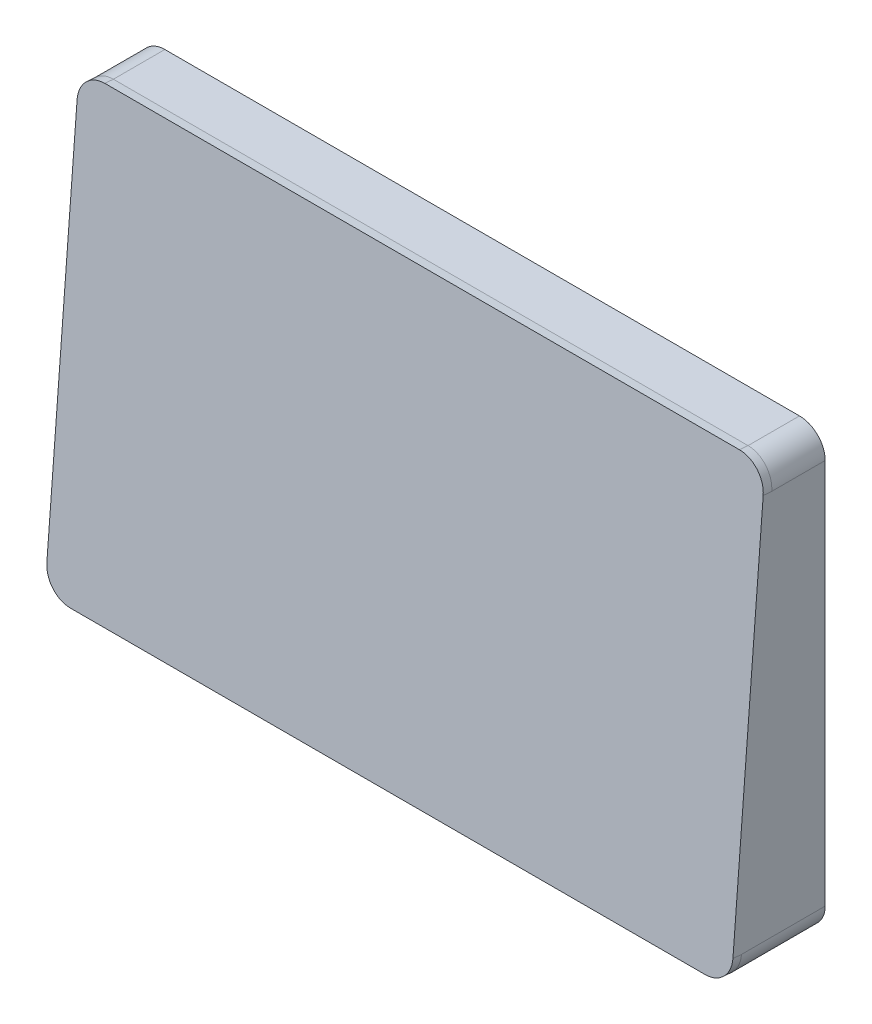
ISO-10303-21;
HEADER;
FILE_DESCRIPTION(('STEP AP214'),'2;1');
FILE_NAME('part.step','',(''),(''),'','','');
FILE_SCHEMA(('AUTOMOTIVE_DESIGN { 1 0 10303 214 1 1 1 1 }'));
ENDSEC;
DATA;
#1=APPLICATION_CONTEXT('core data for automotive mechanical design processes');
#2=APPLICATION_PROTOCOL_DEFINITION('international standard','automotive_design',2000,#1);
#3=PRODUCT_CONTEXT('',#1,'mechanical');
#4=PRODUCT('Part','Part','',(#3));
#5=PRODUCT_RELATED_PRODUCT_CATEGORY('part','',(#4));
#6=PRODUCT_DEFINITION_FORMATION('','',#4);
#7=PRODUCT_DEFINITION_CONTEXT('part definition',#1,'design');
#8=PRODUCT_DEFINITION('design','',#6,#7);
#9=PRODUCT_DEFINITION_SHAPE('','',#8);
#10=(LENGTH_UNIT() NAMED_UNIT(*) SI_UNIT(.MILLI.,.METRE.));
#11=(NAMED_UNIT(*) PLANE_ANGLE_UNIT() SI_UNIT($,.RADIAN.));
#12=(NAMED_UNIT(*) SI_UNIT($,.STERADIAN.) SOLID_ANGLE_UNIT());
#13=UNCERTAINTY_MEASURE_WITH_UNIT(LENGTH_MEASURE(1.E-05),#10,'distance_accuracy_value','');
#14=(GEOMETRIC_REPRESENTATION_CONTEXT(3) GLOBAL_UNCERTAINTY_ASSIGNED_CONTEXT((#13)) GLOBAL_UNIT_ASSIGNED_CONTEXT((#10,
#11,#12)) REPRESENTATION_CONTEXT('',''));
#15=CARTESIAN_POINT('',(0.,0.,0.));
#16=DIRECTION('',(0.,0.,1.));
#17=DIRECTION('',(1.,0.,0.));
#18=AXIS2_PLACEMENT_3D('',#15,#16,#17);
#19=CARTESIAN_POINT('',(-147.675,90.1,0.));
#20=DIRECTION('',(0.,0.,1.));
#21=DIRECTION('',(1.,0.,0.));
#22=AXIS2_PLACEMENT_3D('',#19,#20,#21);
#23=PLANE('',#22);
#24=CARTESIAN_POINT('',(-147.675,90.1,0.));
#25=DIRECTION('',(0.,0.,1.));
#26=DIRECTION('',(1.,0.,0.));
#27=AXIS2_PLACEMENT_3D('',#24,#25,#26);
#28=CIRCLE('',#27,5.99999999999998);
#29=CARTESIAN_POINT('',(-147.675,96.1,0.));
#30=VERTEX_POINT('',#29);
#31=CARTESIAN_POINT('',(-153.675,90.1,0.));
#32=VERTEX_POINT('',#31);
#33=EDGE_CURVE('E358',#30,#32,#28,.T.);
#34=ORIENTED_EDGE('',*,*,#33,.F.);
#35=DIRECTION('',(-1.,0.,0.));
#36=VECTOR('',#35,1.);
#37=CARTESIAN_POINT('',(-147.675,96.1,0.));
#38=LINE('',#37,#36);
#39=CARTESIAN_POINT('',(0.32500000000016,96.1,0.));
#40=VERTEX_POINT('',#39);
#41=EDGE_CURVE('E341',#40,#30,#38,.T.);
#42=ORIENTED_EDGE('',*,*,#41,.F.);
#43=CARTESIAN_POINT('',(0.325000000000156,90.1,0.));
#44=DIRECTION('',(0.,0.,1.));
#45=DIRECTION('',(1.,0.,0.));
#46=AXIS2_PLACEMENT_3D('',#43,#44,#45);
#47=CIRCLE('',#46,6.);
#48=CARTESIAN_POINT('',(6.32500000000016,90.1,0.));
#49=VERTEX_POINT('',#48);
#50=EDGE_CURVE('E344',#49,#40,#47,.T.);
#51=ORIENTED_EDGE('',*,*,#50,.F.);
#52=DIRECTION('',(0.,1.,0.));
#53=VECTOR('',#52,1.);
#54=CARTESIAN_POINT('',(6.32500000000015,90.1,0.));
#55=LINE('',#54,#53);
#56=CARTESIAN_POINT('',(6.32500000000014,0.0999999999999988,0.));
#57=VERTEX_POINT('',#56);
#58=EDGE_CURVE('E347',#57,#49,#55,.T.);
#59=ORIENTED_EDGE('',*,*,#58,.F.);
#60=CARTESIAN_POINT('',(0.325000000000145,0.1,0.));
#61=DIRECTION('',(0.,0.,1.));
#62=DIRECTION('',(1.,0.,0.));
#63=AXIS2_PLACEMENT_3D('',#60,#61,#62);
#64=CIRCLE('',#63,6.);
#65=CARTESIAN_POINT('',(0.325000000000144,-5.9,0.));
#66=VERTEX_POINT('',#65);
#67=EDGE_CURVE('E350',#66,#57,#64,.T.);
#68=ORIENTED_EDGE('',*,*,#67,.F.);
#69=DIRECTION('',(1.,0.,0.));
#70=VECTOR('',#69,1.);
#71=CARTESIAN_POINT('',(0.325000000000145,-5.9,0.));
#72=LINE('',#71,#70);
#73=CARTESIAN_POINT('',(-147.675,-5.89999999999998,0.));
#74=VERTEX_POINT('',#73);
#75=EDGE_CURVE('E353',#74,#66,#72,.T.);
#76=ORIENTED_EDGE('',*,*,#75,.F.);
#77=CARTESIAN_POINT('',(-147.675,0.1,0.));
#78=DIRECTION('',(0.,0.,1.));
#79=DIRECTION('',(1.,0.,0.));
#80=AXIS2_PLACEMENT_3D('',#77,#78,#79);
#81=CIRCLE('',#80,5.99999999999998);
#82=CARTESIAN_POINT('',(-153.675,0.0999999999999877,0.));
#83=VERTEX_POINT('',#82);
#84=EDGE_CURVE('E355',#83,#74,#81,.T.);
#85=ORIENTED_EDGE('',*,*,#84,.F.);
#86=DIRECTION('',(0.,-1.,0.));
#87=VECTOR('',#86,1.);
#88=CARTESIAN_POINT('',(-153.675,0.0999999999999873,0.));
#89=LINE('',#88,#87);
#90=EDGE_CURVE('E321',#32,#83,#89,.T.);
#91=ORIENTED_EDGE('',*,*,#90,.F.);
#92=EDGE_LOOP('',(#34,#42,#51,#59,#68,#76,#85,#91));
#93=FACE_BOUND('',#92,.T.);
#94=CARTESIAN_POINT('',(0.325000000000156,90.1,0.));
#95=DIRECTION('',(0.,0.,1.));
#96=DIRECTION('',(1.,0.,0.));
#97=AXIS2_PLACEMENT_3D('',#94,#95,#96);
#98=CIRCLE('',#97,3.);
#99=CARTESIAN_POINT('',(3.32500000000016,90.1,0.));
#100=VERTEX_POINT('',#99);
#101=CARTESIAN_POINT('',(0.325000000000158,93.1,0.));
#102=VERTEX_POINT('',#101);
#103=EDGE_CURVE('E399',#100,#102,#98,.T.);
#104=ORIENTED_EDGE('',*,*,#103,.T.);
#105=DIRECTION('',(-1.,0.,0.));
#106=VECTOR('',#105,1.);
#107=CARTESIAN_POINT('',(-147.675,93.1,0.));
#108=LINE('',#107,#106);
#109=CARTESIAN_POINT('',(-147.675,93.1,0.));
#110=VERTEX_POINT('',#109);
#111=EDGE_CURVE('E396',#102,#110,#108,.T.);
#112=ORIENTED_EDGE('',*,*,#111,.T.);
#113=CARTESIAN_POINT('',(-147.675,90.1,0.));
#114=DIRECTION('',(0.,0.,1.));
#115=DIRECTION('',(1.,0.,0.));
#116=AXIS2_PLACEMENT_3D('',#113,#114,#115);
#117=CIRCLE('',#116,2.99999999999998);
#118=CARTESIAN_POINT('',(-150.675,90.1,0.));
#119=VERTEX_POINT('',#118);
#120=EDGE_CURVE('E393',#110,#119,#117,.T.);
#121=ORIENTED_EDGE('',*,*,#120,.T.);
#122=DIRECTION('',(0.,-1.,0.));
#123=VECTOR('',#122,1.);
#124=CARTESIAN_POINT('',(-150.675,0.0999999999999873,0.));
#125=LINE('',#124,#123);
#126=CARTESIAN_POINT('',(-150.675,0.0999999999999886,0.));
#127=VERTEX_POINT('',#126);
#128=EDGE_CURVE('E390',#119,#127,#125,.T.);
#129=ORIENTED_EDGE('',*,*,#128,.T.);
#130=CARTESIAN_POINT('',(-147.675,0.1,0.));
#131=DIRECTION('',(0.,0.,1.));
#132=DIRECTION('',(1.,0.,0.));
#133=AXIS2_PLACEMENT_3D('',#130,#131,#132);
#134=CIRCLE('',#133,2.99999999999998);
#135=CARTESIAN_POINT('',(-147.675,-2.89999999999999,0.));
#136=VERTEX_POINT('',#135);
#137=EDGE_CURVE('E387',#127,#136,#134,.T.);
#138=ORIENTED_EDGE('',*,*,#137,.T.);
#139=DIRECTION('',(1.,0.,0.));
#140=VECTOR('',#139,1.);
#141=CARTESIAN_POINT('',(0.325000000000145,-2.9,0.));
#142=LINE('',#141,#140);
#143=CARTESIAN_POINT('',(0.325000000000144,-2.9,0.));
#144=VERTEX_POINT('',#143);
#145=EDGE_CURVE('E384',#136,#144,#142,.T.);
#146=ORIENTED_EDGE('',*,*,#145,.T.);
#147=CARTESIAN_POINT('',(0.325000000000145,0.1,0.));
#148=DIRECTION('',(0.,0.,1.));
#149=DIRECTION('',(1.,0.,0.));
#150=AXIS2_PLACEMENT_3D('',#147,#148,#149);
#151=CIRCLE('',#150,3.);
#152=CARTESIAN_POINT('',(3.32500000000014,0.0999999999999999,0.));
#153=VERTEX_POINT('',#152);
#154=EDGE_CURVE('E381',#144,#153,#151,.T.);
#155=ORIENTED_EDGE('',*,*,#154,.T.);
#156=DIRECTION('',(0.,1.,0.));
#157=VECTOR('',#156,1.);
#158=CARTESIAN_POINT('',(3.32500000000016,90.1,0.));
#159=LINE('',#158,#157);
#160=EDGE_CURVE('E378',#153,#100,#159,.T.);
#161=ORIENTED_EDGE('',*,*,#160,.T.);
#162=EDGE_LOOP('',(#104,#112,#121,#129,#138,#146,#155,#161));
#163=FACE_BOUND('',#162,.T.);
#164=ADVANCED_FACE('F33',(#93,#163),#23,.F.);
#165=CARTESIAN_POINT('',(-147.675,90.1,20.));
#166=DIRECTION('',(0.,0.,-1.));
#167=DIRECTION('',(-1.,0.,0.));
#168=AXIS2_PLACEMENT_3D('',#165,#166,#167);
#169=CYLINDRICAL_SURFACE('',#168,5.99999999999998);
#170=DIRECTION('',(0.,0.,-1.));
#171=VECTOR('',#170,1.);
#172=CARTESIAN_POINT('',(-153.675,90.1,20.));
#173=LINE('',#172,#171);
#174=CARTESIAN_POINT('',(-153.675,90.1,12.4705882352941));
#175=VERTEX_POINT('',#174);
#176=EDGE_CURVE('E41',#175,#32,#173,.T.);
#177=ORIENTED_EDGE('',*,*,#176,.F.);
#178=CARTESIAN_POINT('',(-147.675,90.1,12.4705882352941));
#179=DIRECTION('',(0.,-0.0781912453186315,-0.996938377812552));
#180=DIRECTION('',(0.,0.996938377812552,-0.0781912453186315));
#181=AXIS2_PLACEMENT_3D('',#178,#179,#180);
#182=ELLIPSE('',#181,6.01842614702523,5.99999999999998);
#183=CARTESIAN_POINT('',(-147.675,96.1,12.));
#184=VERTEX_POINT('',#183);
#185=EDGE_CURVE('E402',#175,#184,#182,.T.);
#186=ORIENTED_EDGE('',*,*,#185,.T.);
#187=DIRECTION('',(0.,0.,-1.));
#188=VECTOR('',#187,1.);
#189=CARTESIAN_POINT('',(-147.675,96.1,20.));
#190=LINE('',#189,#188);
#191=EDGE_CURVE('E338',#184,#30,#190,.T.);
#192=ORIENTED_EDGE('',*,*,#191,.T.);
#193=ORIENTED_EDGE('',*,*,#33,.T.);
#194=EDGE_LOOP('',(#177,#186,#192,#193));
#195=FACE_BOUND('',#194,.T.);
#196=ADVANCED_FACE('F35',(#195),#169,.T.);
#197=CARTESIAN_POINT('',(-153.675,0.0999999999999873,20.));
#198=DIRECTION('',(1.,0.,0.));
#199=DIRECTION('',(0.,1.,0.));
#200=AXIS2_PLACEMENT_3D('',#197,#198,#199);
#201=PLANE('',#200);
#202=DIRECTION('',(0.,0.,-1.));
#203=VECTOR('',#202,1.);
#204=CARTESIAN_POINT('',(-153.675,0.0999999999999877,20.));
#205=LINE('',#204,#203);
#206=CARTESIAN_POINT('',(-153.675,0.0999999999999951,19.5294117647059));
#207=VERTEX_POINT('',#206);
#208=EDGE_CURVE('E317',#207,#83,#205,.T.);
#209=ORIENTED_EDGE('',*,*,#208,.F.);
#210=DIRECTION('',(0.,-0.0781912453186315,-0.996938377812551));
#211=VECTOR('',#210,1.);
#212=CARTESIAN_POINT('',(-153.675,0.256382490637258,21.523288520331));
#213=LINE('',#212,#211);
#214=CARTESIAN_POINT('',(-153.675,0.256382490637258,21.523288520331));
#215=VERTEX_POINT('',#214);
#216=EDGE_CURVE('E318',#215,#207,#213,.T.);
#217=ORIENTED_EDGE('',*,*,#216,.F.);
#218=DIRECTION('',(0.,-0.996938377812551,0.0781912453186315));
#219=VECTOR('',#218,1.);
#220=CARTESIAN_POINT('',(-153.675,90.2563824906373,14.4644649909192));
#221=LINE('',#220,#219);
#222=CARTESIAN_POINT('',(-153.675,90.2563824906373,14.4644649909192));
#223=VERTEX_POINT('',#222);
#224=EDGE_CURVE('E238',#223,#215,#221,.T.);
#225=ORIENTED_EDGE('',*,*,#224,.F.);
#226=DIRECTION('',(0.,-0.0781912453186315,-0.996938377812551));
#227=VECTOR('',#226,1.);
#228=CARTESIAN_POINT('',(-153.675,90.2563824906373,14.4644649909192));
#229=LINE('',#228,#227);
#230=EDGE_CURVE('E437',#223,#175,#229,.T.);
#231=ORIENTED_EDGE('',*,*,#230,.T.);
#232=ORIENTED_EDGE('',*,*,#176,.T.);
#233=ORIENTED_EDGE('',*,*,#90,.T.);
#234=EDGE_LOOP('',(#209,#217,#225,#231,#232,#233));
#235=FACE_BOUND('',#234,.T.);
#236=ADVANCED_FACE('F306',(#235),#201,.F.);
#237=CARTESIAN_POINT('',(-147.675,0.1,20.));
#238=DIRECTION('',(0.,0.,-1.));
#239=DIRECTION('',(-1.,0.,0.));
#240=AXIS2_PLACEMENT_3D('',#237,#238,#239);
#241=CYLINDRICAL_SURFACE('',#240,5.99999999999998);
#242=DIRECTION('',(0.,0.,-1.));
#243=VECTOR('',#242,1.);
#244=CARTESIAN_POINT('',(-147.675,-5.89999999999998,20.));
#245=LINE('',#244,#243);
#246=CARTESIAN_POINT('',(-147.675,-5.89999999999998,20.));
#247=VERTEX_POINT('',#246);
#248=EDGE_CURVE('E324',#247,#74,#245,.T.);
#249=ORIENTED_EDGE('',*,*,#248,.F.);
#250=CARTESIAN_POINT('',(-147.675,0.1,19.5294117647059));
#251=DIRECTION('',(0.,-0.0781912453186315,-0.996938377812552));
#252=DIRECTION('',(0.,0.996938377812552,-0.0781912453186315));
#253=AXIS2_PLACEMENT_3D('',#250,#251,#252);
#254=ELLIPSE('',#253,6.01842614702523,5.99999999999998);
#255=EDGE_CURVE('E405',#247,#207,#254,.T.);
#256=ORIENTED_EDGE('',*,*,#255,.T.);
#257=ORIENTED_EDGE('',*,*,#208,.T.);
#258=ORIENTED_EDGE('',*,*,#84,.T.);
#259=EDGE_LOOP('',(#249,#256,#257,#258));
#260=FACE_BOUND('',#259,.T.);
#261=ADVANCED_FACE('F303',(#260),#241,.T.);
#262=CARTESIAN_POINT('',(0.325000000000145,-5.9,20.));
#263=DIRECTION('',(0.,1.,0.));
#264=DIRECTION('',(-1.,0.,0.));
#265=AXIS2_PLACEMENT_3D('',#262,#263,#264);
#266=PLANE('',#265);
#267=CARTESIAN_POINT('',(-5.67499999999985,-5.90000000000002,10.25));
#268=DIRECTION('',(0.,1.,0.));
#269=DIRECTION('',(-1.,0.,0.));
#270=AXIS2_PLACEMENT_3D('',#267,#268,#269);
#271=CIRCLE('',#270,1.);
#272=CARTESIAN_POINT('',(-6.67499999999985,-5.90000000000002,10.25));
#273=VERTEX_POINT('',#272);
#274=EDGE_CURVE('E225',#273,#273,#271,.T.);
#275=ORIENTED_EDGE('',*,*,#274,.T.);
#276=EDGE_LOOP('',(#275));
#277=FACE_BOUND('',#276,.T.);
#278=CARTESIAN_POINT('',(-9.67499999999985,-5.90000000000002,10.25));
#279=DIRECTION('',(0.,1.,0.));
#280=DIRECTION('',(-1.,0.,0.));
#281=AXIS2_PLACEMENT_3D('',#278,#279,#280);
#282=CIRCLE('',#281,1.);
#283=CARTESIAN_POINT('',(-10.6749999999999,-5.90000000000002,10.25));
#284=VERTEX_POINT('',#283);
#285=EDGE_CURVE('E572',#284,#284,#282,.T.);
#286=ORIENTED_EDGE('',*,*,#285,.T.);
#287=EDGE_LOOP('',(#286));
#288=FACE_BOUND('',#287,.T.);
#289=DIRECTION('',(-1.,0.,0.));
#290=VECTOR('',#289,1.);
#291=CARTESIAN_POINT('',(-135.675,-5.9,8.));
#292=LINE('',#291,#290);
#293=CARTESIAN_POINT('',(-126.675,-5.9,8.));
#294=VERTEX_POINT('',#293);
#295=CARTESIAN_POINT('',(-135.675,-5.9,8.));
#296=VERTEX_POINT('',#295);
#297=EDGE_CURVE('E202',#294,#296,#292,.T.);
#298=ORIENTED_EDGE('',*,*,#297,.T.);
#299=DIRECTION('',(0.,0.,1.));
#300=VECTOR('',#299,1.);
#301=CARTESIAN_POINT('',(-135.675,-5.9,12.5));
#302=LINE('',#301,#300);
#303=CARTESIAN_POINT('',(-135.675,-5.9,12.5));
#304=VERTEX_POINT('',#303);
#305=EDGE_CURVE('E196',#296,#304,#302,.T.);
#306=ORIENTED_EDGE('',*,*,#305,.T.);
#307=DIRECTION('',(1.,0.,0.));
#308=VECTOR('',#307,1.);
#309=CARTESIAN_POINT('',(-135.675,-5.9,12.5));
#310=LINE('',#309,#308);
#311=CARTESIAN_POINT('',(-126.675,-5.89999999999998,12.5));
#312=VERTEX_POINT('',#311);
#313=EDGE_CURVE('E205',#304,#312,#310,.T.);
#314=ORIENTED_EDGE('',*,*,#313,.T.);
#315=DIRECTION('',(0.,0.,-1.));
#316=VECTOR('',#315,1.);
#317=CARTESIAN_POINT('',(-126.675,-5.9,12.5));
#318=LINE('',#317,#316);
#319=EDGE_CURVE('E48',#312,#294,#318,.T.);
#320=ORIENTED_EDGE('',*,*,#319,.T.);
#321=EDGE_LOOP('',(#298,#306,#314,#320));
#322=FACE_BOUND('',#321,.T.);
#323=ORIENTED_EDGE('',*,*,#75,.T.);
#324=DIRECTION('',(0.,0.,-1.));
#325=VECTOR('',#324,1.);
#326=CARTESIAN_POINT('',(0.325000000000144,-5.9,20.));
#327=LINE('',#326,#325);
#328=CARTESIAN_POINT('',(0.325000000000144,-5.9,20.));
#329=VERTEX_POINT('',#328);
#330=EDGE_CURVE('E327',#329,#66,#327,.T.);
#331=ORIENTED_EDGE('',*,*,#330,.F.);
#332=DIRECTION('',(1.,0.,0.));
#333=VECTOR('',#332,1.);
#334=CARTESIAN_POINT('',(0.325000000000145,-5.9,20.));
#335=LINE('',#334,#333);
#336=EDGE_CURVE('E340',#247,#329,#335,.T.);
#337=ORIENTED_EDGE('',*,*,#336,.F.);
#338=ORIENTED_EDGE('',*,*,#248,.T.);
#339=EDGE_LOOP('',(#323,#331,#337,#338));
#340=FACE_BOUND('',#339,.T.);
#341=ADVANCED_FACE('F209',(#277,#288,#322,#340),#266,.F.);
#342=CARTESIAN_POINT('',(0.325000000000145,0.1,20.));
#343=DIRECTION('',(0.,0.,-1.));
#344=DIRECTION('',(-1.,0.,0.));
#345=AXIS2_PLACEMENT_3D('',#342,#343,#344);
#346=CYLINDRICAL_SURFACE('',#345,6.);
#347=DIRECTION('',(0.,0.,-1.));
#348=VECTOR('',#347,1.);
#349=CARTESIAN_POINT('',(6.32500000000014,0.0999999999999988,20.));
#350=LINE('',#349,#348);
#351=CARTESIAN_POINT('',(6.32500000000015,0.100000000000015,19.5294117647059));
#352=VERTEX_POINT('',#351);
#353=EDGE_CURVE('E332',#352,#57,#350,.T.);
#354=ORIENTED_EDGE('',*,*,#353,.F.);
#355=CARTESIAN_POINT('',(0.325000000000145,0.1,19.5294117647059));
#356=DIRECTION('',(0.,-0.0781912453186315,-0.996938377812552));
#357=DIRECTION('',(0.,0.996938377812552,-0.0781912453186315));
#358=AXIS2_PLACEMENT_3D('',#355,#356,#357);
#359=ELLIPSE('',#358,6.01842614702525,6.);
#360=EDGE_CURVE('E407',#352,#329,#359,.T.);
#361=ORIENTED_EDGE('',*,*,#360,.T.);
#362=ORIENTED_EDGE('',*,*,#330,.T.);
#363=ORIENTED_EDGE('',*,*,#67,.T.);
#364=EDGE_LOOP('',(#354,#361,#362,#363));
#365=FACE_BOUND('',#364,.T.);
#366=ADVANCED_FACE('F296',(#365),#346,.T.);
#367=CARTESIAN_POINT('',(6.32500000000015,90.1,20.));
#368=DIRECTION('',(-1.,0.,0.));
#369=DIRECTION('',(0.,-1.,0.));
#370=AXIS2_PLACEMENT_3D('',#367,#368,#369);
#371=PLANE('',#370);
#372=DIRECTION('',(0.,0.,-1.));
#373=VECTOR('',#372,1.);
#374=CARTESIAN_POINT('',(6.32500000000016,90.1,20.));
#375=LINE('',#374,#373);
#376=CARTESIAN_POINT('',(6.32500000000015,90.1,12.4705882352941));
#377=VERTEX_POINT('',#376);
#378=EDGE_CURVE('E334',#377,#49,#375,.T.);
#379=ORIENTED_EDGE('',*,*,#378,.F.);
#380=DIRECTION('',(0.,-0.0781912453186315,-0.996938377812551));
#381=VECTOR('',#380,1.);
#382=CARTESIAN_POINT('',(6.32500000000015,90.2563824906373,14.4644649909192));
#383=LINE('',#382,#381);
#384=CARTESIAN_POINT('',(6.32500000000015,90.2563824906373,14.4644649909192));
#385=VERTEX_POINT('',#384);
#386=EDGE_CURVE('E449',#385,#377,#383,.T.);
#387=ORIENTED_EDGE('',*,*,#386,.F.);
#388=DIRECTION('',(0.,0.996938377812551,-0.0781912453186315));
#389=VECTOR('',#388,1.);
#390=CARTESIAN_POINT('',(6.32500000000014,0.256382490637278,21.523288520331));
#391=LINE('',#390,#389);
#392=CARTESIAN_POINT('',(6.32500000000015,0.256382490637278,21.523288520331));
#393=VERTEX_POINT('',#392);
#394=EDGE_CURVE('E461',#393,#385,#391,.T.);
#395=ORIENTED_EDGE('',*,*,#394,.F.);
#396=DIRECTION('',(0.,-0.0781912453186315,-0.996938377812551));
#397=VECTOR('',#396,1.);
#398=CARTESIAN_POINT('',(6.32500000000015,0.256382490637278,21.523288520331));
#399=LINE('',#398,#397);
#400=EDGE_CURVE('E446',#393,#352,#399,.T.);
#401=ORIENTED_EDGE('',*,*,#400,.T.);
#402=ORIENTED_EDGE('',*,*,#353,.T.);
#403=ORIENTED_EDGE('',*,*,#58,.T.);
#404=EDGE_LOOP('',(#379,#387,#395,#401,#402,#403));
#405=FACE_BOUND('',#404,.T.);
#406=ADVANCED_FACE('F292',(#405),#371,.F.);
#407=CARTESIAN_POINT('',(0.325000000000156,90.1,20.));
#408=DIRECTION('',(0.,0.,-1.));
#409=DIRECTION('',(-1.,0.,0.));
#410=AXIS2_PLACEMENT_3D('',#407,#408,#409);
#411=CYLINDRICAL_SURFACE('',#410,6.);
#412=DIRECTION('',(0.,0.,-1.));
#413=VECTOR('',#412,1.);
#414=CARTESIAN_POINT('',(0.32500000000016,96.1,20.));
#415=LINE('',#414,#413);
#416=CARTESIAN_POINT('',(0.32500000000016,96.1,12.));
#417=VERTEX_POINT('',#416);
#418=EDGE_CURVE('E336',#417,#40,#415,.T.);
#419=ORIENTED_EDGE('',*,*,#418,.F.);
#420=CARTESIAN_POINT('',(0.325000000000156,90.1,12.4705882352941));
#421=DIRECTION('',(0.,-0.0781912453186315,-0.996938377812552));
#422=DIRECTION('',(0.,0.996938377812552,-0.0781912453186315));
#423=AXIS2_PLACEMENT_3D('',#420,#421,#422);
#424=ELLIPSE('',#423,6.01842614702525,6.);
#425=EDGE_CURVE('E410',#417,#377,#424,.T.);
#426=ORIENTED_EDGE('',*,*,#425,.T.);
#427=ORIENTED_EDGE('',*,*,#378,.T.);
#428=ORIENTED_EDGE('',*,*,#50,.T.);
#429=EDGE_LOOP('',(#419,#426,#427,#428));
#430=FACE_BOUND('',#429,.T.);
#431=ADVANCED_FACE('F288',(#430),#411,.T.);
#432=CARTESIAN_POINT('',(-147.675,96.1,20.));
#433=DIRECTION('',(0.,-1.,0.));
#434=DIRECTION('',(1.,0.,0.));
#435=AXIS2_PLACEMENT_3D('',#432,#433,#434);
#436=PLANE('',#435);
#437=ORIENTED_EDGE('',*,*,#191,.F.);
#438=DIRECTION('',(1.,0.,0.));
#439=VECTOR('',#438,1.);
#440=CARTESIAN_POINT('',(-153.675,96.1,12.));
#441=LINE('',#440,#439);
#442=EDGE_CURVE('E434',#184,#417,#441,.T.);
#443=ORIENTED_EDGE('',*,*,#442,.T.);
#444=ORIENTED_EDGE('',*,*,#418,.T.);
#445=ORIENTED_EDGE('',*,*,#41,.T.);
#446=EDGE_LOOP('',(#437,#443,#444,#445));
#447=FACE_BOUND('',#446,.T.);
#448=ADVANCED_FACE('F281',(#447),#436,.F.);
#449=CARTESIAN_POINT('',(0.325000000000156,90.1,20.));
#450=DIRECTION('',(0.,0.,-1.));
#451=DIRECTION('',(-1.,0.,0.));
#452=AXIS2_PLACEMENT_3D('',#449,#450,#451);
#453=CYLINDRICAL_SURFACE('',#452,3.);
#454=CARTESIAN_POINT('',(0.325000000000156,90.1,12.4705882352941));
#455=DIRECTION('',(0.,-0.0781912453186315,-0.996938377812552));
#456=DIRECTION('',(0.,0.996938377812552,-0.0781912453186315));
#457=AXIS2_PLACEMENT_3D('',#454,#455,#456);
#458=ELLIPSE('',#457,3.00921307351263,3.);
#459=CARTESIAN_POINT('',(0.325000000000158,93.1,12.2352941176471));
#460=VERTEX_POINT('',#459);
#461=CARTESIAN_POINT('',(3.32500000000016,90.1,12.4705882352941));
#462=VERTEX_POINT('',#461);
#463=EDGE_CURVE('E413',#460,#462,#458,.T.);
#464=ORIENTED_EDGE('',*,*,#463,.F.);
#465=DIRECTION('',(0.,0.,-1.));
#466=VECTOR('',#465,1.);
#467=CARTESIAN_POINT('',(0.325000000000158,93.1,20.));
#468=LINE('',#467,#466);
#469=EDGE_CURVE('E361',#460,#102,#468,.T.);
#470=ORIENTED_EDGE('',*,*,#469,.T.);
#471=ORIENTED_EDGE('',*,*,#103,.F.);
#472=DIRECTION('',(0.,0.,-1.));
#473=VECTOR('',#472,1.);
#474=CARTESIAN_POINT('',(3.32500000000016,90.1,20.));
#475=LINE('',#474,#473);
#476=EDGE_CURVE('E376',#462,#100,#475,.T.);
#477=ORIENTED_EDGE('',*,*,#476,.F.);
#478=EDGE_LOOP('',(#464,#470,#471,#477));
#479=FACE_BOUND('',#478,.T.);
#480=ADVANCED_FACE('F277',(#479),#453,.F.);
#481=CARTESIAN_POINT('',(-147.675,93.1,20.));
#482=DIRECTION('',(0.,-1.,0.));
#483=DIRECTION('',(1.,0.,0.));
#484=AXIS2_PLACEMENT_3D('',#481,#482,#483);
#485=PLANE('',#484);
#486=DIRECTION('',(1.,0.,0.));
#487=VECTOR('',#486,1.);
#488=CARTESIAN_POINT('',(-147.675,93.1,12.2352941176471));
#489=LINE('',#488,#487);
#490=CARTESIAN_POINT('',(-147.675,93.1,12.2352941176471));
#491=VERTEX_POINT('',#490);
#492=EDGE_CURVE('E416',#491,#460,#489,.T.);
#493=ORIENTED_EDGE('',*,*,#492,.F.);
#494=DIRECTION('',(0.,0.,-1.));
#495=VECTOR('',#494,1.);
#496=CARTESIAN_POINT('',(-147.675,93.1,20.));
#497=LINE('',#496,#495);
#498=EDGE_CURVE('E364',#491,#110,#497,.T.);
#499=ORIENTED_EDGE('',*,*,#498,.T.);
#500=ORIENTED_EDGE('',*,*,#111,.F.);
#501=ORIENTED_EDGE('',*,*,#469,.F.);
#502=EDGE_LOOP('',(#493,#499,#500,#501));
#503=FACE_BOUND('',#502,.T.);
#504=ADVANCED_FACE('F273',(#503),#485,.T.);
#505=CARTESIAN_POINT('',(-147.675,90.1,20.));
#506=DIRECTION('',(0.,0.,-1.));
#507=DIRECTION('',(-1.,0.,0.));
#508=AXIS2_PLACEMENT_3D('',#505,#506,#507);
#509=CYLINDRICAL_SURFACE('',#508,2.99999999999998);
#510=CARTESIAN_POINT('',(-147.675,90.1,12.4705882352941));
#511=DIRECTION('',(0.,-0.0781912453186315,-0.996938377812552));
#512=DIRECTION('',(0.,0.996938377812552,-0.0781912453186315));
#513=AXIS2_PLACEMENT_3D('',#510,#511,#512);
#514=ELLIPSE('',#513,3.00921307351261,2.99999999999998);
#515=CARTESIAN_POINT('',(-150.675,90.1,12.4705882352941));
#516=VERTEX_POINT('',#515);
#517=EDGE_CURVE('E419',#516,#491,#514,.T.);
#518=ORIENTED_EDGE('',*,*,#517,.F.);
#519=DIRECTION('',(0.,0.,-1.));
#520=VECTOR('',#519,1.);
#521=CARTESIAN_POINT('',(-150.675,90.1,20.));
#522=LINE('',#521,#520);
#523=EDGE_CURVE('E366',#516,#119,#522,.T.);
#524=ORIENTED_EDGE('',*,*,#523,.T.);
#525=ORIENTED_EDGE('',*,*,#120,.F.);
#526=ORIENTED_EDGE('',*,*,#498,.F.);
#527=EDGE_LOOP('',(#518,#524,#525,#526));
#528=FACE_BOUND('',#527,.T.);
#529=ADVANCED_FACE('F269',(#528),#509,.F.);
#530=CARTESIAN_POINT('',(-150.675,0.0999999999999873,20.));
#531=DIRECTION('',(1.,0.,0.));
#532=DIRECTION('',(0.,1.,0.));
#533=AXIS2_PLACEMENT_3D('',#530,#531,#532);
#534=PLANE('',#533);
#535=DIRECTION('',(0.,0.996938377812552,-0.0781912453186315));
#536=VECTOR('',#535,1.);
#537=CARTESIAN_POINT('',(-150.675,0.0633167749331169,19.5322888803974));
#538=LINE('',#537,#536);
#539=CARTESIAN_POINT('',(-150.675,0.0999999999999886,19.5294117647059));
#540=VERTEX_POINT('',#539);
#541=EDGE_CURVE('E422',#540,#516,#538,.T.);
#542=ORIENTED_EDGE('',*,*,#541,.F.);
#543=DIRECTION('',(0.,0.,-1.));
#544=VECTOR('',#543,1.);
#545=CARTESIAN_POINT('',(-150.675,0.0999999999999886,20.));
#546=LINE('',#545,#544);
#547=EDGE_CURVE('E368',#540,#127,#546,.T.);
#548=ORIENTED_EDGE('',*,*,#547,.T.);
#549=ORIENTED_EDGE('',*,*,#128,.F.);
#550=ORIENTED_EDGE('',*,*,#523,.F.);
#551=EDGE_LOOP('',(#542,#548,#549,#550));
#552=FACE_BOUND('',#551,.T.);
#553=ADVANCED_FACE('F265',(#552),#534,.T.);
#554=CARTESIAN_POINT('',(-147.675,0.1,20.));
#555=DIRECTION('',(0.,0.,-1.));
#556=DIRECTION('',(-1.,0.,0.));
#557=AXIS2_PLACEMENT_3D('',#554,#555,#556);
#558=CYLINDRICAL_SURFACE('',#557,2.99999999999998);
#559=CARTESIAN_POINT('',(-147.675,0.1,19.5294117647059));
#560=DIRECTION('',(0.,-0.0781912453186315,-0.996938377812552));
#561=DIRECTION('',(0.,0.996938377812552,-0.0781912453186315));
#562=AXIS2_PLACEMENT_3D('',#559,#560,#561);
#563=ELLIPSE('',#562,3.00921307351261,2.99999999999998);
#564=CARTESIAN_POINT('',(-147.675,-2.89999999999999,19.7647058823529));
#565=VERTEX_POINT('',#564);
#566=EDGE_CURVE('E425',#565,#540,#563,.T.);
#567=ORIENTED_EDGE('',*,*,#566,.F.);
#568=DIRECTION('',(0.,0.,-1.));
#569=VECTOR('',#568,1.);
#570=CARTESIAN_POINT('',(-147.675,-2.89999999999999,20.));
#571=LINE('',#570,#569);
#572=EDGE_CURVE('E370',#565,#136,#571,.T.);
#573=ORIENTED_EDGE('',*,*,#572,.T.);
#574=ORIENTED_EDGE('',*,*,#137,.F.);
#575=ORIENTED_EDGE('',*,*,#547,.F.);
#576=EDGE_LOOP('',(#567,#573,#574,#575));
#577=FACE_BOUND('',#576,.T.);
#578=ADVANCED_FACE('F261',(#577),#558,.F.);
#579=CARTESIAN_POINT('',(0.325000000000145,-2.9,20.));
#580=DIRECTION('',(0.,1.,0.));
#581=DIRECTION('',(-1.,0.,0.));
#582=AXIS2_PLACEMENT_3D('',#579,#580,#581);
#583=PLANE('',#582);
#584=CARTESIAN_POINT('',(-5.67499999999985,-2.9,10.25));
#585=DIRECTION('',(0.,1.,0.));
#586=DIRECTION('',(-1.,0.,0.));
#587=AXIS2_PLACEMENT_3D('',#584,#585,#586);
#588=CIRCLE('',#587,1.);
#589=CARTESIAN_POINT('',(-6.67499999999985,-2.9,10.25));
#590=VERTEX_POINT('',#589);
#591=EDGE_CURVE('E576',#590,#590,#588,.T.);
#592=ORIENTED_EDGE('',*,*,#591,.F.);
#593=EDGE_LOOP('',(#592));
#594=FACE_BOUND('',#593,.T.);
#595=CARTESIAN_POINT('',(-9.67499999999985,-2.9,10.25));
#596=DIRECTION('',(0.,1.,0.));
#597=DIRECTION('',(-1.,0.,0.));
#598=AXIS2_PLACEMENT_3D('',#595,#596,#597);
#599=CIRCLE('',#598,1.);
#600=CARTESIAN_POINT('',(-10.6749999999999,-2.9,10.25));
#601=VERTEX_POINT('',#600);
#602=EDGE_CURVE('E218',#601,#601,#599,.T.);
#603=ORIENTED_EDGE('',*,*,#602,.F.);
#604=EDGE_LOOP('',(#603));
#605=FACE_BOUND('',#604,.T.);
#606=DIRECTION('',(0.,0.,1.));
#607=VECTOR('',#606,1.);
#608=CARTESIAN_POINT('',(-135.675,-2.89999999999999,12.5));
#609=LINE('',#608,#607);
#610=CARTESIAN_POINT('',(-135.675,-2.89999999999999,8.));
#611=VERTEX_POINT('',#610);
#612=CARTESIAN_POINT('',(-135.675,-2.89999999999999,12.5));
#613=VERTEX_POINT('',#612);
#614=EDGE_CURVE('E56',#611,#613,#609,.T.);
#615=ORIENTED_EDGE('',*,*,#614,.F.);
#616=DIRECTION('',(-1.,0.,0.));
#617=VECTOR('',#616,1.);
#618=CARTESIAN_POINT('',(-135.675,-2.89999999999999,8.));
#619=LINE('',#618,#617);
#620=CARTESIAN_POINT('',(-126.675,-2.89999999999999,8.));
#621=VERTEX_POINT('',#620);
#622=EDGE_CURVE('E212',#621,#611,#619,.T.);
#623=ORIENTED_EDGE('',*,*,#622,.F.);
#624=DIRECTION('',(0.,0.,-1.));
#625=VECTOR('',#624,1.);
#626=CARTESIAN_POINT('',(-126.675,-2.89999999999999,12.5));
#627=LINE('',#626,#625);
#628=CARTESIAN_POINT('',(-126.675,-2.89999999999999,12.5));
#629=VERTEX_POINT('',#628);
#630=EDGE_CURVE('E215',#629,#621,#627,.T.);
#631=ORIENTED_EDGE('',*,*,#630,.F.);
#632=DIRECTION('',(1.,0.,0.));
#633=VECTOR('',#632,1.);
#634=CARTESIAN_POINT('',(-135.675,-2.89999999999999,12.5));
#635=LINE('',#634,#633);
#636=EDGE_CURVE('E224',#613,#629,#635,.T.);
#637=ORIENTED_EDGE('',*,*,#636,.F.);
#638=EDGE_LOOP('',(#615,#623,#631,#637));
#639=FACE_BOUND('',#638,.T.);
#640=DIRECTION('',(-1.,0.,0.));
#641=VECTOR('',#640,1.);
#642=CARTESIAN_POINT('',(0.325000000000145,-2.9,19.7647058823529));
#643=LINE('',#642,#641);
#644=CARTESIAN_POINT('',(0.325000000000144,-2.9,19.7647058823529));
#645=VERTEX_POINT('',#644);
#646=EDGE_CURVE('E428',#645,#565,#643,.T.);
#647=ORIENTED_EDGE('',*,*,#646,.F.);
#648=DIRECTION('',(0.,0.,-1.));
#649=VECTOR('',#648,1.);
#650=CARTESIAN_POINT('',(0.325000000000144,-2.9,20.));
#651=LINE('',#650,#649);
#652=EDGE_CURVE('E372',#645,#144,#651,.T.);
#653=ORIENTED_EDGE('',*,*,#652,.T.);
#654=ORIENTED_EDGE('',*,*,#145,.F.);
#655=ORIENTED_EDGE('',*,*,#572,.F.);
#656=EDGE_LOOP('',(#647,#653,#654,#655));
#657=FACE_BOUND('',#656,.T.);
#658=ADVANCED_FACE('F257',(#594,#605,#639,#657),#583,.T.);
#659=CARTESIAN_POINT('',(0.325000000000145,0.1,20.));
#660=DIRECTION('',(0.,0.,-1.));
#661=DIRECTION('',(-1.,0.,0.));
#662=AXIS2_PLACEMENT_3D('',#659,#660,#661);
#663=CYLINDRICAL_SURFACE('',#662,3.);
#664=CARTESIAN_POINT('',(0.325000000000145,0.1,19.5294117647059));
#665=DIRECTION('',(0.,-0.0781912453186315,-0.996938377812552));
#666=DIRECTION('',(0.,0.996938377812552,-0.0781912453186315));
#667=AXIS2_PLACEMENT_3D('',#664,#665,#666);
#668=ELLIPSE('',#667,3.00921307351263,3.);
#669=CARTESIAN_POINT('',(3.32500000000014,0.100000000000003,19.5294117647059));
#670=VERTEX_POINT('',#669);
#671=EDGE_CURVE('E431',#670,#645,#668,.T.);
#672=ORIENTED_EDGE('',*,*,#671,.F.);
#673=DIRECTION('',(0.,0.,-1.));
#674=VECTOR('',#673,1.);
#675=CARTESIAN_POINT('',(3.32500000000014,0.0999999999999999,20.));
#676=LINE('',#675,#674);
#677=EDGE_CURVE('E374',#670,#153,#676,.T.);
#678=ORIENTED_EDGE('',*,*,#677,.T.);
#679=ORIENTED_EDGE('',*,*,#154,.F.);
#680=ORIENTED_EDGE('',*,*,#652,.F.);
#681=EDGE_LOOP('',(#672,#678,#679,#680));
#682=FACE_BOUND('',#681,.T.);
#683=ADVANCED_FACE('F253',(#682),#663,.F.);
#684=CARTESIAN_POINT('',(3.32500000000016,90.1,20.));
#685=DIRECTION('',(-1.,0.,0.));
#686=DIRECTION('',(0.,-1.,0.));
#687=AXIS2_PLACEMENT_3D('',#684,#685,#686);
#688=PLANE('',#687);
#689=DIRECTION('',(0.,-0.996938377812552,0.0781912453186315));
#690=VECTOR('',#689,1.);
#691=CARTESIAN_POINT('',(3.32500000000016,89.5130683989301,12.5166220863584));
#692=LINE('',#691,#690);
#693=EDGE_CURVE('E11',#462,#670,#692,.T.);
#694=ORIENTED_EDGE('',*,*,#693,.F.);
#695=ORIENTED_EDGE('',*,*,#476,.T.);
#696=ORIENTED_EDGE('',*,*,#160,.F.);
#697=ORIENTED_EDGE('',*,*,#677,.F.);
#698=EDGE_LOOP('',(#694,#695,#696,#697));
#699=FACE_BOUND('',#698,.T.);
#700=ADVANCED_FACE('F249',(#699),#688,.T.);
#701=CARTESIAN_POINT('',(-147.675,90.2563824906373,14.4644649909192));
#702=DIRECTION('',(0.,0.0781912453186315,0.996938377812552));
#703=DIRECTION('',(0.,-0.996938377812552,0.0781912453186315));
#704=AXIS2_PLACEMENT_3D('',#701,#702,#703);
#705=PLANE('',#704);
#706=CARTESIAN_POINT('',(-147.675,90.2563824906373,14.4644649909192));
#707=DIRECTION('',(0.,0.0781912453186315,0.996938377812552));
#708=DIRECTION('',(0.,0.996938377812552,-0.0781912453186315));
#709=AXIS2_PLACEMENT_3D('',#706,#707,#708);
#710=ELLIPSE('',#709,6.01842614702523,5.99999999999998);
#711=CARTESIAN_POINT('',(-147.675,96.2563824906373,13.9938767556251));
#712=VERTEX_POINT('',#711);
#713=EDGE_CURVE('E231',#712,#223,#710,.T.);
#714=ORIENTED_EDGE('',*,*,#713,.T.);
#715=ORIENTED_EDGE('',*,*,#224,.T.);
#716=CARTESIAN_POINT('',(-147.675,0.256382490637263,21.523288520331));
#717=DIRECTION('',(0.,0.0781912453186315,0.996938377812552));
#718=DIRECTION('',(0.,0.996938377812552,-0.0781912453186315));
#719=AXIS2_PLACEMENT_3D('',#716,#717,#718);
#720=ELLIPSE('',#719,6.01842614702523,5.99999999999998);
#721=CARTESIAN_POINT('',(-147.675,-5.74361750936272,21.9938767556251));
#722=VERTEX_POINT('',#721);
#723=EDGE_CURVE('E479',#215,#722,#720,.T.);
#724=ORIENTED_EDGE('',*,*,#723,.T.);
#725=DIRECTION('',(1.,0.,0.));
#726=VECTOR('',#725,1.);
#727=CARTESIAN_POINT('',(-147.675,-5.74361750936272,21.9938767556251));
#728=LINE('',#727,#726);
#729=CARTESIAN_POINT('',(0.325000000000144,-5.74361750936274,21.9938767556251));
#730=VERTEX_POINT('',#729);
#731=EDGE_CURVE('E478',#722,#730,#728,.T.);
#732=ORIENTED_EDGE('',*,*,#731,.T.);
#733=CARTESIAN_POINT('',(0.325000000000145,0.256382490637263,21.523288520331));
#734=DIRECTION('',(0.,0.0781912453186315,0.996938377812552));
#735=DIRECTION('',(0.,0.996938377812552,-0.0781912453186315));
#736=AXIS2_PLACEMENT_3D('',#733,#734,#735);
#737=ELLIPSE('',#736,6.01842614702525,6.);
#738=EDGE_CURVE('E475',#730,#393,#737,.T.);
#739=ORIENTED_EDGE('',*,*,#738,.T.);
#740=ORIENTED_EDGE('',*,*,#394,.T.);
#741=CARTESIAN_POINT('',(0.325000000000156,90.2563824906373,14.4644649909192));
#742=DIRECTION('',(0.,0.0781912453186315,0.996938377812552));
#743=DIRECTION('',(0.,0.996938377812552,-0.0781912453186315));
#744=AXIS2_PLACEMENT_3D('',#741,#742,#743);
#745=ELLIPSE('',#744,6.01842614702526,6.);
#746=CARTESIAN_POINT('',(0.325000000000157,96.2563824906373,13.9938767556251));
#747=VERTEX_POINT('',#746);
#748=EDGE_CURVE('E458',#385,#747,#745,.T.);
#749=ORIENTED_EDGE('',*,*,#748,.T.);
#750=DIRECTION('',(-1.,0.,0.));
#751=VECTOR('',#750,1.);
#752=CARTESIAN_POINT('',(0.325000000000157,96.2563824906373,13.9938767556251));
#753=LINE('',#752,#751);
#754=EDGE_CURVE('E456',#747,#712,#753,.T.);
#755=ORIENTED_EDGE('',*,*,#754,.T.);
#756=EDGE_LOOP('',(#714,#715,#724,#732,#739,#740,#749,#755));
#757=FACE_BOUND('',#756,.T.);
#758=ADVANCED_FACE('F252',(#757),#705,.T.);
#759=CARTESIAN_POINT('',(0.325000000000157,96.2563824906373,13.9938767556251));
#760=DIRECTION('',(0.,-0.996938377812551,0.0781912453186315));
#761=DIRECTION('',(0.,-0.0781912453186315,-0.996938377812552));
#762=AXIS2_PLACEMENT_3D('',#759,#760,#761);
#763=PLANE('',#762);
#764=ORIENTED_EDGE('',*,*,#442,.F.);
#765=DIRECTION('',(0.,-0.0781912453186315,-0.996938377812551));
#766=VECTOR('',#765,1.);
#767=CARTESIAN_POINT('',(-147.675,96.2563824906373,13.9938767556251));
#768=LINE('',#767,#766);
#769=EDGE_CURVE('E453',#712,#184,#768,.T.);
#770=ORIENTED_EDGE('',*,*,#769,.F.);
#771=ORIENTED_EDGE('',*,*,#754,.F.);
#772=DIRECTION('',(0.,-0.0781912453186315,-0.996938377812551));
#773=VECTOR('',#772,1.);
#774=CARTESIAN_POINT('',(0.325000000000157,96.2563824906373,13.9938767556251));
#775=LINE('',#774,#773);
#776=EDGE_CURVE('E451',#747,#417,#775,.T.);
#777=ORIENTED_EDGE('',*,*,#776,.T.);
#778=EDGE_LOOP('',(#764,#770,#771,#777));
#779=FACE_BOUND('',#778,.T.);
#780=ADVANCED_FACE('F469',(#779),#763,.F.);
#781=DIRECTION('',(0.,-0.0781912453186315,-0.996938377812551));
#782=VECTOR('',#781,1.);
#783=SURFACE_OF_LINEAR_EXTRUSION('',#745,#782);
#784=ORIENTED_EDGE('',*,*,#425,.F.);
#785=ORIENTED_EDGE('',*,*,#776,.F.);
#786=ORIENTED_EDGE('',*,*,#748,.F.);
#787=ORIENTED_EDGE('',*,*,#386,.T.);
#788=EDGE_LOOP('',(#784,#785,#786,#787));
#789=FACE_BOUND('',#788,.T.);
#790=ADVANCED_FACE('F464',(#789),#783,.F.);
#791=DIRECTION('',(0.,-0.0781912453186315,-0.996938377812551));
#792=VECTOR('',#791,1.);
#793=SURFACE_OF_LINEAR_EXTRUSION('',#737,#792);
#794=ORIENTED_EDGE('',*,*,#360,.F.);
#795=ORIENTED_EDGE('',*,*,#400,.F.);
#796=ORIENTED_EDGE('',*,*,#738,.F.);
#797=DIRECTION('',(0.,-0.0781912453186315,-0.996938377812551));
#798=VECTOR('',#797,1.);
#799=CARTESIAN_POINT('',(0.325000000000144,-5.74361750936274,21.9938767556251));
#800=LINE('',#799,#798);
#801=EDGE_CURVE('E443',#730,#329,#800,.T.);
#802=ORIENTED_EDGE('',*,*,#801,.T.);
#803=EDGE_LOOP('',(#794,#795,#796,#802));
#804=FACE_BOUND('',#803,.T.);
#805=ADVANCED_FACE('F468',(#804),#793,.F.);
#806=CARTESIAN_POINT('',(-147.675,-5.74361750936272,21.9938767556251));
#807=DIRECTION('',(0.,0.996938377812551,-0.0781912453186315));
#808=DIRECTION('',(0.,0.0781912453186315,0.996938377812552));
#809=AXIS2_PLACEMENT_3D('',#806,#807,#808);
#810=PLANE('',#809);
#811=ORIENTED_EDGE('',*,*,#336,.T.);
#812=ORIENTED_EDGE('',*,*,#801,.F.);
#813=ORIENTED_EDGE('',*,*,#731,.F.);
#814=DIRECTION('',(0.,-0.0781912453186315,-0.996938377812551));
#815=VECTOR('',#814,1.);
#816=CARTESIAN_POINT('',(-147.675,-5.74361750936272,21.9938767556251));
#817=LINE('',#816,#815);
#818=EDGE_CURVE('E440',#722,#247,#817,.T.);
#819=ORIENTED_EDGE('',*,*,#818,.T.);
#820=EDGE_LOOP('',(#811,#812,#813,#819));
#821=FACE_BOUND('',#820,.T.);
#822=ADVANCED_FACE('F473',(#821),#810,.F.);
#823=DIRECTION('',(0.,-0.0781912453186315,-0.996938377812551));
#824=VECTOR('',#823,1.);
#825=SURFACE_OF_LINEAR_EXTRUSION('',#720,#824);
#826=ORIENTED_EDGE('',*,*,#255,.F.);
#827=ORIENTED_EDGE('',*,*,#818,.F.);
#828=ORIENTED_EDGE('',*,*,#723,.F.);
#829=ORIENTED_EDGE('',*,*,#216,.T.);
#830=EDGE_LOOP('',(#826,#827,#828,#829));
#831=FACE_BOUND('',#830,.T.);
#832=ADVANCED_FACE('F246',(#831),#825,.F.);
#833=DIRECTION('',(0.,-0.0781912453186315,-0.996938377812551));
#834=VECTOR('',#833,1.);
#835=SURFACE_OF_LINEAR_EXTRUSION('',#710,#834);
#836=ORIENTED_EDGE('',*,*,#185,.F.);
#837=ORIENTED_EDGE('',*,*,#230,.F.);
#838=ORIENTED_EDGE('',*,*,#713,.F.);
#839=ORIENTED_EDGE('',*,*,#769,.T.);
#840=EDGE_LOOP('',(#836,#837,#838,#839));
#841=FACE_BOUND('',#840,.T.);
#842=ADVANCED_FACE('F241',(#841),#835,.F.);
#843=CARTESIAN_POINT('',(-147.675,90.1,12.4705882352941));
#844=DIRECTION('',(0.,0.0781912453186315,0.996938377812552));
#845=DIRECTION('',(0.,-0.996938377812552,0.0781912453186315));
#846=AXIS2_PLACEMENT_3D('',#843,#844,#845);
#847=PLANE('',#846);
#848=ORIENTED_EDGE('',*,*,#463,.T.);
#849=ORIENTED_EDGE('',*,*,#693,.T.);
#850=ORIENTED_EDGE('',*,*,#671,.T.);
#851=ORIENTED_EDGE('',*,*,#646,.T.);
#852=ORIENTED_EDGE('',*,*,#566,.T.);
#853=ORIENTED_EDGE('',*,*,#541,.T.);
#854=ORIENTED_EDGE('',*,*,#517,.T.);
#855=ORIENTED_EDGE('',*,*,#492,.T.);
#856=EDGE_LOOP('',(#848,#849,#850,#851,#852,#853,#854,#855));
#857=FACE_BOUND('',#856,.T.);
#858=ADVANCED_FACE('F245',(#857),#847,.F.);
#859=CARTESIAN_POINT('',(-135.675,-5.9,12.5));
#860=DIRECTION('',(-1.,0.,0.));
#861=DIRECTION('',(0.,-1.,0.));
#862=AXIS2_PLACEMENT_3D('',#859,#860,#861);
#863=PLANE('',#862);
#864=ORIENTED_EDGE('',*,*,#614,.T.);
#865=DIRECTION('',(0.,1.,0.));
#866=VECTOR('',#865,1.);
#867=CARTESIAN_POINT('',(-135.675,-5.9,12.5));
#868=LINE('',#867,#866);
#869=EDGE_CURVE('E192',#304,#613,#868,.T.);
#870=ORIENTED_EDGE('',*,*,#869,.F.);
#871=ORIENTED_EDGE('',*,*,#305,.F.);
#872=DIRECTION('',(0.,1.,0.));
#873=VECTOR('',#872,1.);
#874=CARTESIAN_POINT('',(-135.675,-5.9,8.));
#875=LINE('',#874,#873);
#876=EDGE_CURVE('E229',#296,#611,#875,.T.);
#877=ORIENTED_EDGE('',*,*,#876,.T.);
#878=EDGE_LOOP('',(#864,#870,#871,#877));
#879=FACE_BOUND('',#878,.T.);
#880=ADVANCED_FACE('F194',(#879),#863,.F.);
#881=CARTESIAN_POINT('',(-135.675,-5.9,8.));
#882=DIRECTION('',(0.,0.,-1.));
#883=DIRECTION('',(-1.,0.,0.));
#884=AXIS2_PLACEMENT_3D('',#881,#882,#883);
#885=PLANE('',#884);
#886=ORIENTED_EDGE('',*,*,#622,.T.);
#887=ORIENTED_EDGE('',*,*,#876,.F.);
#888=ORIENTED_EDGE('',*,*,#297,.F.);
#889=DIRECTION('',(0.,1.,0.));
#890=VECTOR('',#889,1.);
#891=CARTESIAN_POINT('',(-126.675,-5.9,8.));
#892=LINE('',#891,#890);
#893=EDGE_CURVE('E232',#294,#621,#892,.T.);
#894=ORIENTED_EDGE('',*,*,#893,.T.);
#895=EDGE_LOOP('',(#886,#887,#888,#894));
#896=FACE_BOUND('',#895,.T.);
#897=ADVANCED_FACE('F528',(#896),#885,.F.);
#898=CARTESIAN_POINT('',(-126.675,-5.9,12.5));
#899=DIRECTION('',(1.,0.,0.));
#900=DIRECTION('',(0.,1.,0.));
#901=AXIS2_PLACEMENT_3D('',#898,#899,#900);
#902=PLANE('',#901);
#903=ORIENTED_EDGE('',*,*,#630,.T.);
#904=ORIENTED_EDGE('',*,*,#893,.F.);
#905=ORIENTED_EDGE('',*,*,#319,.F.);
#906=DIRECTION('',(0.,1.,0.));
#907=VECTOR('',#906,1.);
#908=CARTESIAN_POINT('',(-126.675,-5.9,12.5));
#909=LINE('',#908,#907);
#910=EDGE_CURVE('E201',#312,#629,#909,.T.);
#911=ORIENTED_EDGE('',*,*,#910,.T.);
#912=EDGE_LOOP('',(#903,#904,#905,#911));
#913=FACE_BOUND('',#912,.T.);
#914=ADVANCED_FACE('F549',(#913),#902,.F.);
#915=CARTESIAN_POINT('',(-135.675,-5.9,12.5));
#916=DIRECTION('',(0.,0.,1.));
#917=DIRECTION('',(1.,0.,0.));
#918=AXIS2_PLACEMENT_3D('',#915,#916,#917);
#919=PLANE('',#918);
#920=ORIENTED_EDGE('',*,*,#636,.T.);
#921=ORIENTED_EDGE('',*,*,#910,.F.);
#922=ORIENTED_EDGE('',*,*,#313,.F.);
#923=ORIENTED_EDGE('',*,*,#869,.T.);
#924=EDGE_LOOP('',(#920,#921,#922,#923));
#925=FACE_BOUND('',#924,.T.);
#926=ADVANCED_FACE('F206',(#925),#919,.F.);
#927=CARTESIAN_POINT('',(-9.67499999999985,-5.90000000000002,10.25));
#928=DIRECTION('',(0.,1.,0.));
#929=DIRECTION('',(-1.,0.,0.));
#930=AXIS2_PLACEMENT_3D('',#927,#928,#929);
#931=CYLINDRICAL_SURFACE('',#930,1.);
#932=ORIENTED_EDGE('',*,*,#285,.F.);
#933=EDGE_LOOP('',(#932));
#934=FACE_BOUND('',#933,.T.);
#935=ORIENTED_EDGE('',*,*,#602,.T.);
#936=EDGE_LOOP('',(#935));
#937=FACE_BOUND('',#936,.T.);
#938=ADVANCED_FACE('F557',(#934,#937),#931,.F.);
#939=CARTESIAN_POINT('',(-5.67499999999985,-5.90000000000002,10.25));
#940=DIRECTION('',(0.,1.,0.));
#941=DIRECTION('',(-1.,0.,0.));
#942=AXIS2_PLACEMENT_3D('',#939,#940,#941);
#943=CYLINDRICAL_SURFACE('',#942,1.);
#944=ORIENTED_EDGE('',*,*,#274,.F.);
#945=EDGE_LOOP('',(#944));
#946=FACE_BOUND('',#945,.T.);
#947=ORIENTED_EDGE('',*,*,#591,.T.);
#948=EDGE_LOOP('',(#947));
#949=FACE_BOUND('',#948,.T.);
#950=ADVANCED_FACE('F563',(#946,#949),#943,.F.);
#951=CLOSED_SHELL('',(#164,#196,#236,#261,#341,#366,#406,#431,#448,#480,#504,#529,#553,#578,
#658,#683,#700,#758,#780,#790,#805,#822,#832,#842,#858,#880,#897,#914,#926,#938,#950));
#952=MANIFOLD_SOLID_BREP('B2',#951);
#953=ADVANCED_BREP_SHAPE_REPRESENTATION('',(#18,#952),#14);
#954=SHAPE_DEFINITION_REPRESENTATION(#9,#953);
ENDSEC;
END-ISO-10303-21;
